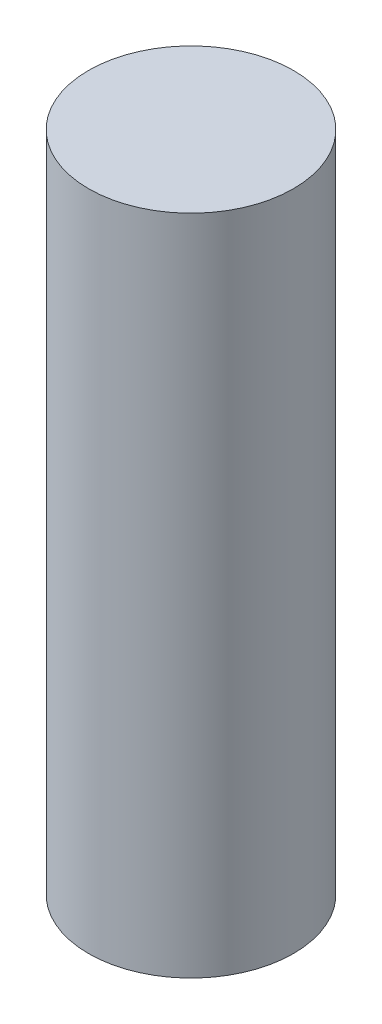
ISO-10303-21;
HEADER;
FILE_DESCRIPTION(('STEP AP214'),'2;1');
FILE_NAME('part.step','',(''),(''),'','','');
FILE_SCHEMA(('AUTOMOTIVE_DESIGN { 1 0 10303 214 1 1 1 1 }'));
ENDSEC;
DATA;
#1=APPLICATION_CONTEXT('core data for automotive mechanical design processes');
#2=APPLICATION_PROTOCOL_DEFINITION('international standard','automotive_design',2000,#1);
#3=PRODUCT_CONTEXT('',#1,'mechanical');
#4=PRODUCT('Part','Part','',(#3));
#5=PRODUCT_RELATED_PRODUCT_CATEGORY('part','',(#4));
#6=PRODUCT_DEFINITION_FORMATION('','',#4);
#7=PRODUCT_DEFINITION_CONTEXT('part definition',#1,'design');
#8=PRODUCT_DEFINITION('design','',#6,#7);
#9=PRODUCT_DEFINITION_SHAPE('','',#8);
#10=(LENGTH_UNIT() NAMED_UNIT(*) SI_UNIT(.MILLI.,.METRE.));
#11=(NAMED_UNIT(*) PLANE_ANGLE_UNIT() SI_UNIT($,.RADIAN.));
#12=(NAMED_UNIT(*) SI_UNIT($,.STERADIAN.) SOLID_ANGLE_UNIT());
#13=UNCERTAINTY_MEASURE_WITH_UNIT(LENGTH_MEASURE(1.E-05),#10,'distance_accuracy_value','');
#14=(GEOMETRIC_REPRESENTATION_CONTEXT(3) GLOBAL_UNCERTAINTY_ASSIGNED_CONTEXT((#13)) GLOBAL_UNIT_ASSIGNED_CONTEXT((#10,
#11,#12)) REPRESENTATION_CONTEXT('',''));
#15=CARTESIAN_POINT('',(0.,0.,0.));
#16=DIRECTION('',(0.,0.,1.));
#17=DIRECTION('',(1.,0.,0.));
#18=AXIS2_PLACEMENT_3D('',#15,#16,#17);
#19=CARTESIAN_POINT('',(0.,80.,0.));
#20=DIRECTION('',(0.,-1.,0.));
#21=DIRECTION('',(0.,0.,-1.));
#22=AXIS2_PLACEMENT_3D('',#19,#20,#21);
#23=CYLINDRICAL_SURFACE('',#22,12.375);
#24=CARTESIAN_POINT('',(0.,80.,0.));
#25=DIRECTION('',(0.,1.,0.));
#26=DIRECTION('',(0.,0.,1.));
#27=AXIS2_PLACEMENT_3D('',#24,#25,#26);
#28=CIRCLE('',#27,12.375);
#29=CARTESIAN_POINT('',(0.,80.,12.375));
#30=VERTEX_POINT('',#29);
#31=EDGE_CURVE('E44',#30,#30,#28,.T.);
#32=ORIENTED_EDGE('',*,*,#31,.F.);
#33=EDGE_LOOP('',(#32));
#34=FACE_BOUND('',#33,.T.);
#35=CARTESIAN_POINT('',(0.,0.,0.));
#36=DIRECTION('',(0.,1.,0.));
#37=DIRECTION('',(0.,0.,1.));
#38=AXIS2_PLACEMENT_3D('',#35,#36,#37);
#39=CIRCLE('',#38,12.375);
#40=CARTESIAN_POINT('',(0.,0.,12.375));
#41=VERTEX_POINT('',#40);
#42=EDGE_CURVE('E46',#41,#41,#39,.T.);
#43=ORIENTED_EDGE('',*,*,#42,.T.);
#44=EDGE_LOOP('',(#43));
#45=FACE_BOUND('',#44,.T.);
#46=ADVANCED_FACE('F32',(#34,#45),#23,.T.);
#47=CARTESIAN_POINT('',(0.,80.,0.));
#48=DIRECTION('',(0.,1.,0.));
#49=DIRECTION('',(0.,0.,1.));
#50=AXIS2_PLACEMENT_3D('',#47,#48,#49);
#51=PLANE('',#50);
#52=ORIENTED_EDGE('',*,*,#31,.T.);
#53=EDGE_LOOP('',(#52));
#54=FACE_BOUND('',#53,.T.);
#55=ADVANCED_FACE('F52',(#54),#51,.T.);
#56=CARTESIAN_POINT('',(0.,0.,0.));
#57=DIRECTION('',(0.,1.,0.));
#58=DIRECTION('',(0.,0.,1.));
#59=AXIS2_PLACEMENT_3D('',#56,#57,#58);
#60=PLANE('',#59);
#61=ORIENTED_EDGE('',*,*,#42,.F.);
#62=EDGE_LOOP('',(#61));
#63=FACE_BOUND('',#62,.T.);
#64=ADVANCED_FACE('F59',(#63),#60,.F.);
#65=CLOSED_SHELL('',(#46,#55,#64));
#66=CARTESIAN_POINT('',(0.,80.,0.));
#67=DIRECTION('',(0.,-1.,0.));
#68=DIRECTION('',(0.,0.,-1.));
#69=AXIS2_PLACEMENT_3D('',#66,#67,#68);
#70=CYLINDRICAL_SURFACE('',#69,9.875);
#71=CARTESIAN_POINT('',(0.,77.5,0.));
#72=DIRECTION('',(0.,1.,0.));
#73=DIRECTION('',(0.,0.,1.));
#74=AXIS2_PLACEMENT_3D('',#71,#72,#73);
#75=CIRCLE('',#74,9.875);
#76=CARTESIAN_POINT('',(0.,77.5,9.875));
#77=VERTEX_POINT('',#76);
#78=EDGE_CURVE('E10',#77,#77,#75,.T.);
#79=ORIENTED_EDGE('',*,*,#78,.T.);
#80=EDGE_LOOP('',(#79));
#81=FACE_BOUND('',#80,.T.);
#82=CARTESIAN_POINT('',(0.,2.5,0.));
#83=DIRECTION('',(0.,1.,0.));
#84=DIRECTION('',(0.,0.,1.));
#85=AXIS2_PLACEMENT_3D('',#82,#83,#84);
#86=CIRCLE('',#85,9.875);
#87=CARTESIAN_POINT('',(0.,2.5,9.875));
#88=VERTEX_POINT('',#87);
#89=EDGE_CURVE('E36',#88,#88,#86,.T.);
#90=ORIENTED_EDGE('',*,*,#89,.F.);
#91=EDGE_LOOP('',(#90));
#92=FACE_BOUND('',#91,.T.);
#93=ADVANCED_FACE('F68',(#81,#92),#70,.F.);
#94=CARTESIAN_POINT('',(0.,77.5,0.));
#95=DIRECTION('',(0.,1.,0.));
#96=DIRECTION('',(0.,0.,1.));
#97=AXIS2_PLACEMENT_3D('',#94,#95,#96);
#98=PLANE('',#97);
#99=ORIENTED_EDGE('',*,*,#78,.F.);
#100=EDGE_LOOP('',(#99));
#101=FACE_BOUND('',#100,.T.);
#102=ADVANCED_FACE('F69',(#101),#98,.F.);
#103=CARTESIAN_POINT('',(0.,2.5,0.));
#104=DIRECTION('',(0.,1.,0.));
#105=DIRECTION('',(0.,0.,1.));
#106=AXIS2_PLACEMENT_3D('',#103,#104,#105);
#107=PLANE('',#106);
#108=ORIENTED_EDGE('',*,*,#89,.T.);
#109=EDGE_LOOP('',(#108));
#110=FACE_BOUND('',#109,.T.);
#111=ADVANCED_FACE('F34',(#110),#107,.T.);
#112=CLOSED_SHELL('',(#93,#102,#111));
#113=ORIENTED_CLOSED_SHELL('',*,#112,.T.);
#114=BREP_WITH_VOIDS('B2',#65,(#113));
#115=ADVANCED_BREP_SHAPE_REPRESENTATION('',(#18,#114),#14);
#116=SHAPE_DEFINITION_REPRESENTATION(#9,#115);
ENDSEC;
END-ISO-10303-21;
